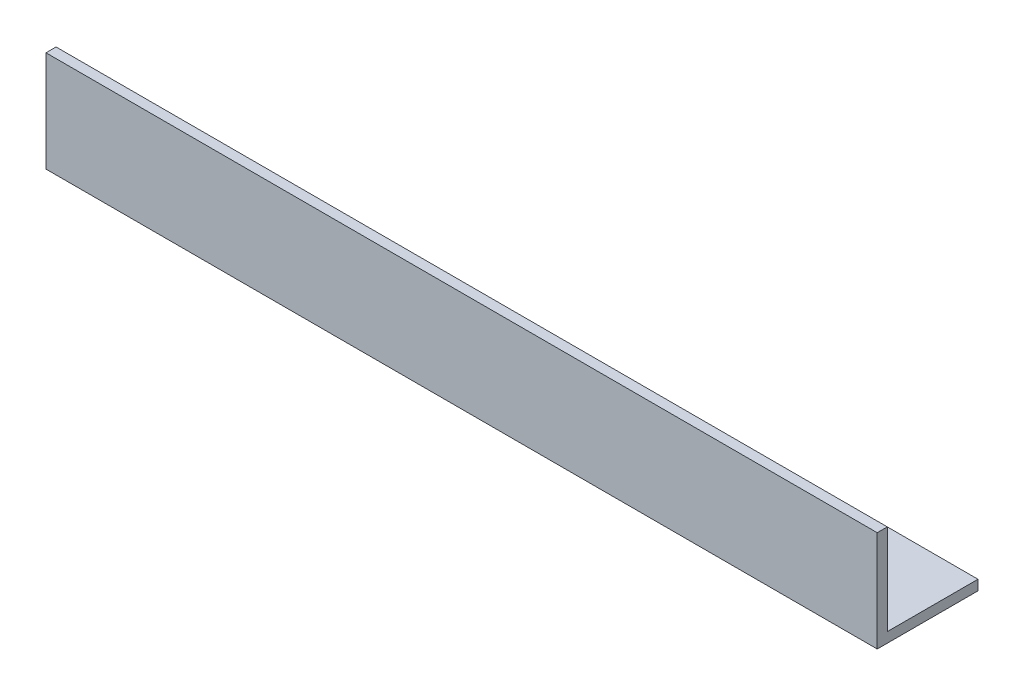
ISO-10303-21;
HEADER;
FILE_DESCRIPTION(('STEP AP214'),'2;1');
FILE_NAME('part.step','',(''),(''),'','','');
FILE_SCHEMA(('AUTOMOTIVE_DESIGN { 1 0 10303 214 1 1 1 1 }'));
ENDSEC;
DATA;
#1=APPLICATION_CONTEXT('core data for automotive mechanical design processes');
#2=APPLICATION_PROTOCOL_DEFINITION('international standard','automotive_design',2000,#1);
#3=PRODUCT_CONTEXT('',#1,'mechanical');
#4=PRODUCT('Part','Part','',(#3));
#5=PRODUCT_RELATED_PRODUCT_CATEGORY('part','',(#4));
#6=PRODUCT_DEFINITION_FORMATION('','',#4);
#7=PRODUCT_DEFINITION_CONTEXT('part definition',#1,'design');
#8=PRODUCT_DEFINITION('design','',#6,#7);
#9=PRODUCT_DEFINITION_SHAPE('','',#8);
#10=(LENGTH_UNIT() NAMED_UNIT(*) SI_UNIT(.MILLI.,.METRE.));
#11=(NAMED_UNIT(*) PLANE_ANGLE_UNIT() SI_UNIT($,.RADIAN.));
#12=(NAMED_UNIT(*) SI_UNIT($,.STERADIAN.) SOLID_ANGLE_UNIT());
#13=UNCERTAINTY_MEASURE_WITH_UNIT(LENGTH_MEASURE(1.E-05),#10,'distance_accuracy_value','');
#14=(GEOMETRIC_REPRESENTATION_CONTEXT(3) GLOBAL_UNCERTAINTY_ASSIGNED_CONTEXT((#13)) GLOBAL_UNIT_ASSIGNED_CONTEXT((#10,
#11,#12)) REPRESENTATION_CONTEXT('',''));
#15=CARTESIAN_POINT('',(0.,0.,0.));
#16=DIRECTION('',(0.,0.,1.));
#17=DIRECTION('',(1.,0.,0.));
#18=AXIS2_PLACEMENT_3D('',#15,#16,#17);
#19=CARTESIAN_POINT('',(165.,20.,0.));
#20=DIRECTION('',(0.,-1.,0.));
#21=DIRECTION('',(0.,0.,-1.));
#22=AXIS2_PLACEMENT_3D('',#19,#20,#21);
#23=PLANE('',#22);
#24=DIRECTION('',(0.,0.,1.));
#25=VECTOR('',#24,1.);
#26=CARTESIAN_POINT('',(0.,20.,0.));
#27=LINE('',#26,#25);
#28=CARTESIAN_POINT('',(0.,20.,-2.));
#29=VERTEX_POINT('',#28);
#30=CARTESIAN_POINT('',(0.,20.,0.));
#31=VERTEX_POINT('',#30);
#32=EDGE_CURVE('E123',#29,#31,#27,.T.);
#33=ORIENTED_EDGE('',*,*,#32,.T.);
#34=DIRECTION('',(-1.,0.,0.));
#35=VECTOR('',#34,1.);
#36=CARTESIAN_POINT('',(165.,20.,0.));
#37=LINE('',#36,#35);
#38=CARTESIAN_POINT('',(165.,20.,0.));
#39=VERTEX_POINT('',#38);
#40=EDGE_CURVE('E11',#39,#31,#37,.T.);
#41=ORIENTED_EDGE('',*,*,#40,.F.);
#42=DIRECTION('',(0.,0.,1.));
#43=VECTOR('',#42,1.);
#44=CARTESIAN_POINT('',(165.,20.,0.));
#45=LINE('',#44,#43);
#46=CARTESIAN_POINT('',(165.,20.,-2.));
#47=VERTEX_POINT('',#46);
#48=EDGE_CURVE('E133',#47,#39,#45,.T.);
#49=ORIENTED_EDGE('',*,*,#48,.F.);
#50=DIRECTION('',(-1.,0.,0.));
#51=VECTOR('',#50,1.);
#52=CARTESIAN_POINT('',(165.,20.,-2.));
#53=LINE('',#52,#51);
#54=EDGE_CURVE('E119',#47,#29,#53,.T.);
#55=ORIENTED_EDGE('',*,*,#54,.T.);
#56=EDGE_LOOP('',(#33,#41,#49,#55));
#57=FACE_BOUND('',#56,.T.);
#58=ADVANCED_FACE('F39',(#57),#23,.F.);
#59=CARTESIAN_POINT('',(165.,20.,0.));
#60=DIRECTION('',(0.,0.,-1.));
#61=DIRECTION('',(-1.,0.,0.));
#62=AXIS2_PLACEMENT_3D('',#59,#60,#61);
#63=PLANE('',#62);
#64=DIRECTION('',(0.,-1.,0.));
#65=VECTOR('',#64,1.);
#66=CARTESIAN_POINT('',(0.,20.,0.));
#67=LINE('',#66,#65);
#68=CARTESIAN_POINT('',(0.,0.,0.));
#69=VERTEX_POINT('',#68);
#70=EDGE_CURVE('E126',#31,#69,#67,.T.);
#71=ORIENTED_EDGE('',*,*,#70,.T.);
#72=DIRECTION('',(-1.,0.,0.));
#73=VECTOR('',#72,1.);
#74=CARTESIAN_POINT('',(165.,0.,0.));
#75=LINE('',#74,#73);
#76=CARTESIAN_POINT('',(165.,0.,0.));
#77=VERTEX_POINT('',#76);
#78=EDGE_CURVE('E47',#77,#69,#75,.T.);
#79=ORIENTED_EDGE('',*,*,#78,.F.);
#80=DIRECTION('',(0.,-1.,0.));
#81=VECTOR('',#80,1.);
#82=CARTESIAN_POINT('',(165.,20.,0.));
#83=LINE('',#82,#81);
#84=EDGE_CURVE('E92',#39,#77,#83,.T.);
#85=ORIENTED_EDGE('',*,*,#84,.F.);
#86=ORIENTED_EDGE('',*,*,#40,.T.);
#87=EDGE_LOOP('',(#71,#79,#85,#86));
#88=FACE_BOUND('',#87,.T.);
#89=ADVANCED_FACE('F157',(#88),#63,.F.);
#90=CARTESIAN_POINT('',(165.,0.,0.));
#91=DIRECTION('',(0.,1.,0.));
#92=DIRECTION('',(0.,0.,1.));
#93=AXIS2_PLACEMENT_3D('',#90,#91,#92);
#94=PLANE('',#93);
#95=DIRECTION('',(0.,0.,-1.));
#96=VECTOR('',#95,1.);
#97=CARTESIAN_POINT('',(0.,0.,0.));
#98=LINE('',#97,#96);
#99=CARTESIAN_POINT('',(0.,0.,-20.));
#100=VERTEX_POINT('',#99);
#101=EDGE_CURVE('E128',#69,#100,#98,.T.);
#102=ORIENTED_EDGE('',*,*,#101,.T.);
#103=DIRECTION('',(-1.,0.,0.));
#104=VECTOR('',#103,1.);
#105=CARTESIAN_POINT('',(165.,0.,-20.));
#106=LINE('',#105,#104);
#107=CARTESIAN_POINT('',(165.,0.,-20.));
#108=VERTEX_POINT('',#107);
#109=EDGE_CURVE('E114',#108,#100,#106,.T.);
#110=ORIENTED_EDGE('',*,*,#109,.F.);
#111=DIRECTION('',(0.,0.,-1.));
#112=VECTOR('',#111,1.);
#113=CARTESIAN_POINT('',(165.,0.,0.));
#114=LINE('',#113,#112);
#115=EDGE_CURVE('E105',#77,#108,#114,.T.);
#116=ORIENTED_EDGE('',*,*,#115,.F.);
#117=ORIENTED_EDGE('',*,*,#78,.T.);
#118=EDGE_LOOP('',(#102,#110,#116,#117));
#119=FACE_BOUND('',#118,.T.);
#120=ADVANCED_FACE('F139',(#119),#94,.F.);
#121=CARTESIAN_POINT('',(165.,0.,-20.));
#122=DIRECTION('',(0.,0.,1.));
#123=DIRECTION('',(1.,0.,0.));
#124=AXIS2_PLACEMENT_3D('',#121,#122,#123);
#125=PLANE('',#124);
#126=DIRECTION('',(0.,1.,0.));
#127=VECTOR('',#126,1.);
#128=CARTESIAN_POINT('',(0.,0.,-20.));
#129=LINE('',#128,#127);
#130=CARTESIAN_POINT('',(0.,2.,-20.));
#131=VERTEX_POINT('',#130);
#132=EDGE_CURVE('E113',#100,#131,#129,.T.);
#133=ORIENTED_EDGE('',*,*,#132,.T.);
#134=DIRECTION('',(-1.,0.,0.));
#135=VECTOR('',#134,1.);
#136=CARTESIAN_POINT('',(165.,2.,-20.));
#137=LINE('',#136,#135);
#138=CARTESIAN_POINT('',(165.,2.,-20.));
#139=VERTEX_POINT('',#138);
#140=EDGE_CURVE('E110',#139,#131,#137,.T.);
#141=ORIENTED_EDGE('',*,*,#140,.F.);
#142=DIRECTION('',(0.,1.,0.));
#143=VECTOR('',#142,1.);
#144=CARTESIAN_POINT('',(165.,0.,-20.));
#145=LINE('',#144,#143);
#146=EDGE_CURVE('E99',#108,#139,#145,.T.);
#147=ORIENTED_EDGE('',*,*,#146,.F.);
#148=ORIENTED_EDGE('',*,*,#109,.T.);
#149=EDGE_LOOP('',(#133,#141,#147,#148));
#150=FACE_BOUND('',#149,.T.);
#151=ADVANCED_FACE('F111',(#150),#125,.F.);
#152=CARTESIAN_POINT('',(165.,2.,-20.));
#153=DIRECTION('',(0.,-1.,0.));
#154=DIRECTION('',(0.,0.,-1.));
#155=AXIS2_PLACEMENT_3D('',#152,#153,#154);
#156=PLANE('',#155);
#157=DIRECTION('',(0.,0.,1.));
#158=VECTOR('',#157,1.);
#159=CARTESIAN_POINT('',(0.,2.,-20.));
#160=LINE('',#159,#158);
#161=CARTESIAN_POINT('',(0.,2.,-2.));
#162=VERTEX_POINT('',#161);
#163=EDGE_CURVE('E78',#131,#162,#160,.T.);
#164=ORIENTED_EDGE('',*,*,#163,.T.);
#165=DIRECTION('',(-1.,0.,0.));
#166=VECTOR('',#165,1.);
#167=CARTESIAN_POINT('',(165.,2.,-2.));
#168=LINE('',#167,#166);
#169=CARTESIAN_POINT('',(165.,2.,-2.));
#170=VERTEX_POINT('',#169);
#171=EDGE_CURVE('E115',#170,#162,#168,.T.);
#172=ORIENTED_EDGE('',*,*,#171,.F.);
#173=DIRECTION('',(0.,0.,1.));
#174=VECTOR('',#173,1.);
#175=CARTESIAN_POINT('',(165.,2.,-20.));
#176=LINE('',#175,#174);
#177=EDGE_CURVE('E103',#139,#170,#176,.T.);
#178=ORIENTED_EDGE('',*,*,#177,.F.);
#179=ORIENTED_EDGE('',*,*,#140,.T.);
#180=EDGE_LOOP('',(#164,#172,#178,#179));
#181=FACE_BOUND('',#180,.T.);
#182=ADVANCED_FACE('F117',(#181),#156,.F.);
#183=CARTESIAN_POINT('',(165.,2.,-2.));
#184=DIRECTION('',(0.,0.,1.));
#185=DIRECTION('',(0.,-1.,0.));
#186=AXIS2_PLACEMENT_3D('',#183,#184,#185);
#187=PLANE('',#186);
#188=DIRECTION('',(0.,1.,0.));
#189=VECTOR('',#188,1.);
#190=CARTESIAN_POINT('',(0.,2.,-2.));
#191=LINE('',#190,#189);
#192=EDGE_CURVE('E84',#162,#29,#191,.T.);
#193=ORIENTED_EDGE('',*,*,#192,.T.);
#194=ORIENTED_EDGE('',*,*,#54,.F.);
#195=DIRECTION('',(0.,1.,0.));
#196=VECTOR('',#195,1.);
#197=CARTESIAN_POINT('',(165.,2.,-2.));
#198=LINE('',#197,#196);
#199=EDGE_CURVE('E55',#170,#47,#198,.T.);
#200=ORIENTED_EDGE('',*,*,#199,.F.);
#201=ORIENTED_EDGE('',*,*,#171,.T.);
#202=EDGE_LOOP('',(#193,#194,#200,#201));
#203=FACE_BOUND('',#202,.T.);
#204=ADVANCED_FACE('F146',(#203),#187,.F.);
#205=CARTESIAN_POINT('',(165.,0.,0.));
#206=DIRECTION('',(1.,0.,0.));
#207=DIRECTION('',(0.,0.,-1.));
#208=AXIS2_PLACEMENT_3D('',#205,#206,#207);
#209=PLANE('',#208);
#210=ORIENTED_EDGE('',*,*,#48,.T.);
#211=ORIENTED_EDGE('',*,*,#84,.T.);
#212=ORIENTED_EDGE('',*,*,#115,.T.);
#213=ORIENTED_EDGE('',*,*,#146,.T.);
#214=ORIENTED_EDGE('',*,*,#177,.T.);
#215=ORIENTED_EDGE('',*,*,#199,.T.);
#216=EDGE_LOOP('',(#210,#211,#212,#213,#214,#215));
#217=FACE_BOUND('',#216,.T.);
#218=ADVANCED_FACE('F101',(#217),#209,.T.);
#219=CARTESIAN_POINT('',(0.,0.,0.));
#220=DIRECTION('',(1.,0.,0.));
#221=DIRECTION('',(0.,0.,-1.));
#222=AXIS2_PLACEMENT_3D('',#219,#220,#221);
#223=PLANE('',#222);
#224=ORIENTED_EDGE('',*,*,#32,.F.);
#225=ORIENTED_EDGE('',*,*,#192,.F.);
#226=ORIENTED_EDGE('',*,*,#163,.F.);
#227=ORIENTED_EDGE('',*,*,#132,.F.);
#228=ORIENTED_EDGE('',*,*,#101,.F.);
#229=ORIENTED_EDGE('',*,*,#70,.F.);
#230=EDGE_LOOP('',(#224,#225,#226,#227,#228,#229));
#231=FACE_BOUND('',#230,.T.);
#232=ADVANCED_FACE('F142',(#231),#223,.F.);
#233=CLOSED_SHELL('',(#58,#89,#120,#151,#182,#204,#218,#232));
#234=MANIFOLD_SOLID_BREP('B2',#233);
#235=ADVANCED_BREP_SHAPE_REPRESENTATION('',(#18,#234),#14);
#236=SHAPE_DEFINITION_REPRESENTATION(#9,#235);
ENDSEC;
END-ISO-10303-21;
